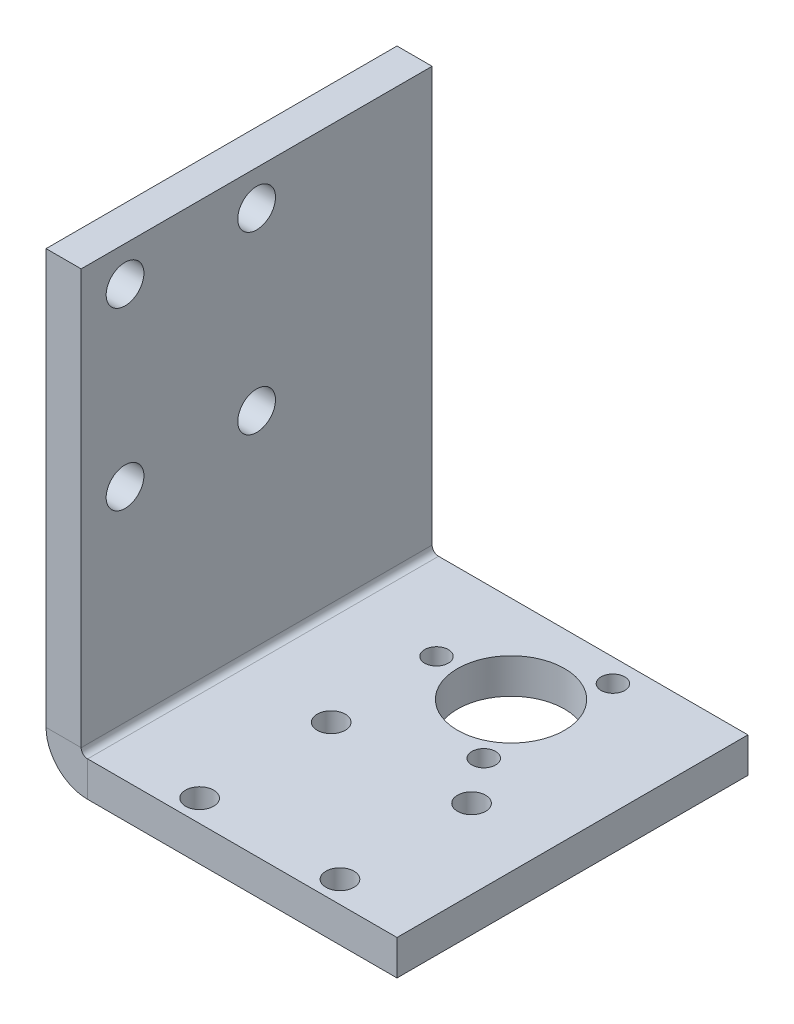
ISO-10303-21;
HEADER;
FILE_DESCRIPTION(('STEP AP214'),'2;1');
FILE_NAME('part.step','',(''),(''),'','','');
FILE_SCHEMA(('AUTOMOTIVE_DESIGN { 1 0 10303 214 1 1 1 1 }'));
ENDSEC;
DATA;
#1=APPLICATION_CONTEXT('core data for automotive mechanical design processes');
#2=APPLICATION_PROTOCOL_DEFINITION('international standard','automotive_design',2000,#1);
#3=PRODUCT_CONTEXT('',#1,'mechanical');
#4=PRODUCT('Part','Part','',(#3));
#5=PRODUCT_RELATED_PRODUCT_CATEGORY('part','',(#4));
#6=PRODUCT_DEFINITION_FORMATION('','',#4);
#7=PRODUCT_DEFINITION_CONTEXT('part definition',#1,'design');
#8=PRODUCT_DEFINITION('design','',#6,#7);
#9=PRODUCT_DEFINITION_SHAPE('','',#8);
#10=(LENGTH_UNIT() NAMED_UNIT(*) SI_UNIT(.MILLI.,.METRE.));
#11=(NAMED_UNIT(*) PLANE_ANGLE_UNIT() SI_UNIT($,.RADIAN.));
#12=(NAMED_UNIT(*) SI_UNIT($,.STERADIAN.) SOLID_ANGLE_UNIT());
#13=UNCERTAINTY_MEASURE_WITH_UNIT(LENGTH_MEASURE(1.E-05),#10,'distance_accuracy_value','');
#14=(GEOMETRIC_REPRESENTATION_CONTEXT(3) GLOBAL_UNCERTAINTY_ASSIGNED_CONTEXT((#13)) GLOBAL_UNIT_ASSIGNED_CONTEXT((#10,
#11,#12)) REPRESENTATION_CONTEXT('',''));
#15=CARTESIAN_POINT('',(0.,0.,0.));
#16=DIRECTION('',(0.,0.,1.));
#17=DIRECTION('',(1.,0.,0.));
#18=AXIS2_PLACEMENT_3D('',#15,#16,#17);
#19=CARTESIAN_POINT('',(0.7366,0.,20.));
#20=DIRECTION('',(0.,0.,1.));
#21=DIRECTION('',(1.,0.,0.));
#22=AXIS2_PLACEMENT_3D('',#19,#20,#21);
#23=PLANE('',#22);
#24=DIRECTION('',(0.,-1.,0.));
#25=VECTOR('',#24,1.);
#26=CARTESIAN_POINT('',(0.7366,0.,20.));
#27=LINE('',#26,#25);
#28=CARTESIAN_POINT('',(0.7366,0.,20.));
#29=VERTEX_POINT('',#28);
#30=CARTESIAN_POINT('',(0.7366,-4.,20.));
#31=VERTEX_POINT('',#30);
#32=EDGE_CURVE('E11',#29,#31,#27,.T.);
#33=ORIENTED_EDGE('',*,*,#32,.F.);
#34=CARTESIAN_POINT('',(0.7366,0.7366,20.));
#35=DIRECTION('',(0.,0.,-1.));
#36=DIRECTION('',(-1.,0.,0.));
#37=AXIS2_PLACEMENT_3D('',#34,#35,#36);
#38=CIRCLE('',#37,0.7366);
#39=CARTESIAN_POINT('',(0.,0.7366,20.));
#40=VERTEX_POINT('',#39);
#41=EDGE_CURVE('E138',#40,#29,#38,.F.);
#42=ORIENTED_EDGE('',*,*,#41,.F.);
#43=DIRECTION('',(1.,0.,0.));
#44=VECTOR('',#43,1.);
#45=CARTESIAN_POINT('',(-4.,0.736600000000001,20.));
#46=LINE('',#45,#44);
#47=CARTESIAN_POINT('',(-4.,0.736600000000001,20.));
#48=VERTEX_POINT('',#47);
#49=EDGE_CURVE('E48',#48,#40,#46,.T.);
#50=ORIENTED_EDGE('',*,*,#49,.F.);
#51=CARTESIAN_POINT('',(0.7366,0.7366,20.));
#52=DIRECTION('',(0.,0.,1.));
#53=DIRECTION('',(1.,0.,0.));
#54=AXIS2_PLACEMENT_3D('',#51,#52,#53);
#55=CIRCLE('',#54,4.7366);
#56=EDGE_CURVE('E131',#48,#31,#55,.T.);
#57=ORIENTED_EDGE('',*,*,#56,.T.);
#58=EDGE_LOOP('',(#33,#42,#50,#57));
#59=FACE_BOUND('',#58,.T.);
#60=ADVANCED_FACE('F39',(#59),#23,.T.);
#61=CARTESIAN_POINT('',(-4.,0.736600000000001,20.));
#62=DIRECTION('',(0.,0.,1.));
#63=DIRECTION('',(1.,0.,0.));
#64=AXIS2_PLACEMENT_3D('',#61,#62,#63);
#65=PLANE('',#64);
#66=DIRECTION('',(1.,0.,0.));
#67=VECTOR('',#66,1.);
#68=CARTESIAN_POINT('',(0.,0.,20.));
#69=LINE('',#68,#67);
#70=CARTESIAN_POINT('',(36.,0.,20.));
#71=VERTEX_POINT('',#70);
#72=EDGE_CURVE('E221',#29,#71,#69,.T.);
#73=ORIENTED_EDGE('',*,*,#72,.F.);
#74=ORIENTED_EDGE('',*,*,#32,.T.);
#75=DIRECTION('',(1.,0.,0.));
#76=VECTOR('',#75,1.);
#77=CARTESIAN_POINT('',(0.,-4.,20.));
#78=LINE('',#77,#76);
#79=CARTESIAN_POINT('',(36.,-4.,20.));
#80=VERTEX_POINT('',#79);
#81=EDGE_CURVE('E97',#31,#80,#78,.T.);
#82=ORIENTED_EDGE('',*,*,#81,.T.);
#83=DIRECTION('',(0.,-1.,0.));
#84=VECTOR('',#83,1.);
#85=CARTESIAN_POINT('',(36.,0.,20.));
#86=LINE('',#85,#84);
#87=EDGE_CURVE('E218',#71,#80,#86,.T.);
#88=ORIENTED_EDGE('',*,*,#87,.F.);
#89=EDGE_LOOP('',(#73,#74,#82,#88));
#90=FACE_BOUND('',#89,.T.);
#91=ADVANCED_FACE('F241',(#90),#65,.T.);
#92=CARTESIAN_POINT('',(0.,0.7366,-20.));
#93=DIRECTION('',(0.,0.,-1.));
#94=DIRECTION('',(-1.,0.,0.));
#95=AXIS2_PLACEMENT_3D('',#92,#93,#94);
#96=PLANE('',#95);
#97=DIRECTION('',(-1.,0.,0.));
#98=VECTOR('',#97,1.);
#99=CARTESIAN_POINT('',(0.,0.7366,-20.));
#100=LINE('',#99,#98);
#101=CARTESIAN_POINT('',(0.,0.7366,-20.));
#102=VERTEX_POINT('',#101);
#103=CARTESIAN_POINT('',(-4.,0.736600000000001,-20.));
#104=VERTEX_POINT('',#103);
#105=EDGE_CURVE('E84',#102,#104,#100,.T.);
#106=ORIENTED_EDGE('',*,*,#105,.F.);
#107=CARTESIAN_POINT('',(0.7366,0.7366,-20.));
#108=DIRECTION('',(0.,0.,-1.));
#109=DIRECTION('',(-1.,0.,0.));
#110=AXIS2_PLACEMENT_3D('',#107,#108,#109);
#111=CIRCLE('',#110,0.7366);
#112=CARTESIAN_POINT('',(0.7366,0.,-20.));
#113=VERTEX_POINT('',#112);
#114=EDGE_CURVE('E154',#102,#113,#111,.F.);
#115=ORIENTED_EDGE('',*,*,#114,.T.);
#116=DIRECTION('',(0.,1.,0.));
#117=VECTOR('',#116,1.);
#118=CARTESIAN_POINT('',(0.7366,-4.,-20.));
#119=LINE('',#118,#117);
#120=CARTESIAN_POINT('',(0.7366,-4.,-20.));
#121=VERTEX_POINT('',#120);
#122=EDGE_CURVE('E91',#121,#113,#119,.T.);
#123=ORIENTED_EDGE('',*,*,#122,.F.);
#124=CARTESIAN_POINT('',(0.7366,0.7366,-20.));
#125=DIRECTION('',(0.,0.,1.));
#126=DIRECTION('',(1.,0.,0.));
#127=AXIS2_PLACEMENT_3D('',#124,#125,#126);
#128=CIRCLE('',#127,4.7366);
#129=EDGE_CURVE('E161',#104,#121,#128,.T.);
#130=ORIENTED_EDGE('',*,*,#129,.F.);
#131=EDGE_LOOP('',(#106,#115,#123,#130));
#132=FACE_BOUND('',#131,.T.);
#133=ADVANCED_FACE('F239',(#132),#96,.T.);
#134=CARTESIAN_POINT('',(0.7366,-4.,-20.));
#135=DIRECTION('',(0.,0.,-1.));
#136=DIRECTION('',(-1.,0.,0.));
#137=AXIS2_PLACEMENT_3D('',#134,#135,#136);
#138=PLANE('',#137);
#139=DIRECTION('',(0.,-1.,0.));
#140=VECTOR('',#139,1.);
#141=CARTESIAN_POINT('',(0.,0.,-20.));
#142=LINE('',#141,#140);
#143=CARTESIAN_POINT('',(0.,48.,-20.));
#144=VERTEX_POINT('',#143);
#145=EDGE_CURVE('E156',#144,#102,#142,.T.);
#146=ORIENTED_EDGE('',*,*,#145,.T.);
#147=ORIENTED_EDGE('',*,*,#105,.T.);
#148=DIRECTION('',(0.,1.,0.));
#149=VECTOR('',#148,1.);
#150=CARTESIAN_POINT('',(-4.,0.,-20.));
#151=LINE('',#150,#149);
#152=CARTESIAN_POINT('',(-4.,48.,-20.));
#153=VERTEX_POINT('',#152);
#154=EDGE_CURVE('E159',#153,#104,#151,.F.);
#155=ORIENTED_EDGE('',*,*,#154,.F.);
#156=DIRECTION('',(1.,0.,0.));
#157=VECTOR('',#156,1.);
#158=CARTESIAN_POINT('',(-4.,48.,-20.));
#159=LINE('',#158,#157);
#160=EDGE_CURVE('E119',#153,#144,#159,.T.);
#161=ORIENTED_EDGE('',*,*,#160,.T.);
#162=EDGE_LOOP('',(#146,#147,#155,#161));
#163=FACE_BOUND('',#162,.T.);
#164=ADVANCED_FACE('F235',(#163),#138,.T.);
#165=CARTESIAN_POINT('',(0.,-4.,20.));
#166=DIRECTION('',(0.,1.,0.));
#167=DIRECTION('',(0.,0.,1.));
#168=AXIS2_PLACEMENT_3D('',#165,#166,#167);
#169=PLANE('',#168);
#170=CARTESIAN_POINT('',(23.2499999999999,-4.,-17.3612159321678));
#171=DIRECTION('',(0.,-1.,0.));
#172=DIRECTION('',(0.,0.,-1.));
#173=AXIS2_PLACEMENT_3D('',#170,#171,#172);
#174=CIRCLE('',#173,1.34999999999999);
#175=CARTESIAN_POINT('',(23.2499999999999,-4.,-18.7112159321678));
#176=VERTEX_POINT('',#175);
#177=EDGE_CURVE('E497',#176,#176,#174,.T.);
#178=ORIENTED_EDGE('',*,*,#177,.F.);
#179=EDGE_LOOP('',(#178));
#180=FACE_BOUND('',#179,.T.);
#181=CARTESIAN_POINT('',(23.25,-4.,-2.63878406783229));
#182=DIRECTION('',(0.,-1.,0.));
#183=DIRECTION('',(0.,0.,-1.));
#184=AXIS2_PLACEMENT_3D('',#181,#182,#183);
#185=CIRCLE('',#184,1.34999999999999);
#186=CARTESIAN_POINT('',(23.25,-4.,-3.98878406783228));
#187=VERTEX_POINT('',#186);
#188=EDGE_CURVE('E499',#187,#187,#185,.T.);
#189=ORIENTED_EDGE('',*,*,#188,.F.);
#190=EDGE_LOOP('',(#189));
#191=FACE_BOUND('',#190,.T.);
#192=CARTESIAN_POINT('',(10.5,-4.,-10.));
#193=DIRECTION('',(0.,-1.,0.));
#194=DIRECTION('',(0.,0.,-1.));
#195=AXIS2_PLACEMENT_3D('',#192,#193,#194);
#196=CIRCLE('',#195,1.35);
#197=CARTESIAN_POINT('',(10.5,-4.,-11.35));
#198=VERTEX_POINT('',#197);
#199=EDGE_CURVE('E506',#198,#198,#196,.T.);
#200=ORIENTED_EDGE('',*,*,#199,.F.);
#201=EDGE_LOOP('',(#200));
#202=FACE_BOUND('',#201,.T.);
#203=CARTESIAN_POINT('',(19.,-4.,-10.));
#204=DIRECTION('',(0.,-1.,0.));
#205=DIRECTION('',(0.,0.,-1.));
#206=AXIS2_PLACEMENT_3D('',#203,#204,#205);
#207=CIRCLE('',#206,6.1);
#208=CARTESIAN_POINT('',(19.,-4.,-16.1));
#209=VERTEX_POINT('',#208);
#210=EDGE_CURVE('E182',#209,#209,#207,.T.);
#211=ORIENTED_EDGE('',*,*,#210,.F.);
#212=EDGE_LOOP('',(#211));
#213=FACE_BOUND('',#212,.T.);
#214=CARTESIAN_POINT('',(27.,-4.,17.5));
#215=DIRECTION('',(0.,1.,0.));
#216=DIRECTION('',(0.,0.,1.));
#217=AXIS2_PLACEMENT_3D('',#214,#215,#216);
#218=CIRCLE('',#217,1.59999999999999);
#219=CARTESIAN_POINT('',(27.,-4.,19.1));
#220=VERTEX_POINT('',#219);
#221=EDGE_CURVE('E186',#220,#220,#218,.T.);
#222=ORIENTED_EDGE('',*,*,#221,.T.);
#223=EDGE_LOOP('',(#222));
#224=FACE_BOUND('',#223,.T.);
#225=CARTESIAN_POINT('',(11.,-4.,2.5));
#226=DIRECTION('',(0.,1.,0.));
#227=DIRECTION('',(0.,0.,1.));
#228=AXIS2_PLACEMENT_3D('',#225,#226,#227);
#229=CIRCLE('',#228,1.59999999999999);
#230=CARTESIAN_POINT('',(11.,-4.,4.09999999999999));
#231=VERTEX_POINT('',#230);
#232=EDGE_CURVE('E203',#231,#231,#229,.T.);
#233=ORIENTED_EDGE('',*,*,#232,.T.);
#234=EDGE_LOOP('',(#233));
#235=FACE_BOUND('',#234,.T.);
#236=CARTESIAN_POINT('',(11.,-4.,17.5));
#237=DIRECTION('',(0.,1.,0.));
#238=DIRECTION('',(0.,0.,1.));
#239=AXIS2_PLACEMENT_3D('',#236,#237,#238);
#240=CIRCLE('',#239,1.59999999999999);
#241=CARTESIAN_POINT('',(11.,-4.,19.1));
#242=VERTEX_POINT('',#241);
#243=EDGE_CURVE('E209',#242,#242,#240,.T.);
#244=ORIENTED_EDGE('',*,*,#243,.T.);
#245=EDGE_LOOP('',(#244));
#246=FACE_BOUND('',#245,.T.);
#247=CARTESIAN_POINT('',(27.,-4.,2.5));
#248=DIRECTION('',(0.,1.,0.));
#249=DIRECTION('',(0.,0.,1.));
#250=AXIS2_PLACEMENT_3D('',#247,#248,#249);
#251=CIRCLE('',#250,1.59999999999999);
#252=CARTESIAN_POINT('',(27.,-4.,4.09999999999999));
#253=VERTEX_POINT('',#252);
#254=EDGE_CURVE('E148',#253,#253,#251,.T.);
#255=ORIENTED_EDGE('',*,*,#254,.T.);
#256=EDGE_LOOP('',(#255));
#257=FACE_BOUND('',#256,.T.);
#258=DIRECTION('',(1.,0.,0.));
#259=VECTOR('',#258,1.);
#260=CARTESIAN_POINT('',(0.,-4.,-20.));
#261=LINE('',#260,#259);
#262=CARTESIAN_POINT('',(36.,-4.,-20.));
#263=VERTEX_POINT('',#262);
#264=EDGE_CURVE('E144',#121,#263,#261,.T.);
#265=ORIENTED_EDGE('',*,*,#264,.T.);
#266=DIRECTION('',(0.,0.,-1.));
#267=VECTOR('',#266,1.);
#268=CARTESIAN_POINT('',(36.,-4.,20.));
#269=LINE('',#268,#267);
#270=EDGE_CURVE('E175',#80,#263,#269,.T.);
#271=ORIENTED_EDGE('',*,*,#270,.F.);
#272=ORIENTED_EDGE('',*,*,#81,.F.);
#273=DIRECTION('',(0.,0.,-1.));
#274=VECTOR('',#273,1.);
#275=CARTESIAN_POINT('',(0.7366,-4.,20.));
#276=LINE('',#275,#274);
#277=EDGE_CURVE('E143',#31,#121,#276,.T.);
#278=ORIENTED_EDGE('',*,*,#277,.T.);
#279=EDGE_LOOP('',(#265,#271,#272,#278));
#280=FACE_BOUND('',#279,.T.);
#281=ADVANCED_FACE('F247',(#180,#191,#202,#213,#224,#235,#246,#257,#280),#169,.F.);
#282=CARTESIAN_POINT('',(36.,0.,20.));
#283=DIRECTION('',(1.,0.,0.));
#284=DIRECTION('',(0.,0.,-1.));
#285=AXIS2_PLACEMENT_3D('',#282,#283,#284);
#286=PLANE('',#285);
#287=DIRECTION('',(0.,-1.,0.));
#288=VECTOR('',#287,1.);
#289=CARTESIAN_POINT('',(36.,0.,-20.));
#290=LINE('',#289,#288);
#291=CARTESIAN_POINT('',(36.,0.,-20.));
#292=VERTEX_POINT('',#291);
#293=EDGE_CURVE('E147',#292,#263,#290,.T.);
#294=ORIENTED_EDGE('',*,*,#293,.F.);
#295=DIRECTION('',(0.,0.,-1.));
#296=VECTOR('',#295,1.);
#297=CARTESIAN_POINT('',(36.,0.,20.));
#298=LINE('',#297,#296);
#299=EDGE_CURVE('E173',#71,#292,#298,.T.);
#300=ORIENTED_EDGE('',*,*,#299,.F.);
#301=ORIENTED_EDGE('',*,*,#87,.T.);
#302=ORIENTED_EDGE('',*,*,#270,.T.);
#303=EDGE_LOOP('',(#294,#300,#301,#302));
#304=FACE_BOUND('',#303,.T.);
#305=ADVANCED_FACE('F276',(#304),#286,.T.);
#306=CARTESIAN_POINT('',(0.,0.,20.));
#307=DIRECTION('',(0.,1.,0.));
#308=DIRECTION('',(0.,0.,1.));
#309=AXIS2_PLACEMENT_3D('',#306,#307,#308);
#310=PLANE('',#309);
#311=CARTESIAN_POINT('',(23.2499999999999,0.,-17.3612159321678));
#312=DIRECTION('',(0.,1.,0.));
#313=DIRECTION('',(0.,0.,1.));
#314=AXIS2_PLACEMENT_3D('',#311,#312,#313);
#315=CIRCLE('',#314,1.34999999999999);
#316=CARTESIAN_POINT('',(23.2499999999999,0.,-16.0112159321678));
#317=VERTEX_POINT('',#316);
#318=EDGE_CURVE('E42',#317,#317,#315,.T.);
#319=ORIENTED_EDGE('',*,*,#318,.F.);
#320=EDGE_LOOP('',(#319));
#321=FACE_BOUND('',#320,.T.);
#322=CARTESIAN_POINT('',(23.25,0.,-2.63878406783229));
#323=DIRECTION('',(0.,1.,0.));
#324=DIRECTION('',(0.,0.,1.));
#325=AXIS2_PLACEMENT_3D('',#322,#323,#324);
#326=CIRCLE('',#325,1.34999999999999);
#327=CARTESIAN_POINT('',(23.25,0.,-1.2887840678323));
#328=VERTEX_POINT('',#327);
#329=EDGE_CURVE('E503',#328,#328,#326,.T.);
#330=ORIENTED_EDGE('',*,*,#329,.F.);
#331=EDGE_LOOP('',(#330));
#332=FACE_BOUND('',#331,.T.);
#333=CARTESIAN_POINT('',(10.5,0.,-10.));
#334=DIRECTION('',(0.,1.,0.));
#335=DIRECTION('',(0.,0.,1.));
#336=AXIS2_PLACEMENT_3D('',#333,#334,#335);
#337=CIRCLE('',#336,1.34999999999999);
#338=CARTESIAN_POINT('',(10.5,0.,-8.65000000000001));
#339=VERTEX_POINT('',#338);
#340=EDGE_CURVE('E509',#339,#339,#337,.T.);
#341=ORIENTED_EDGE('',*,*,#340,.F.);
#342=EDGE_LOOP('',(#341));
#343=FACE_BOUND('',#342,.T.);
#344=CARTESIAN_POINT('',(19.,0.,-10.));
#345=DIRECTION('',(0.,1.,0.));
#346=DIRECTION('',(0.,0.,1.));
#347=AXIS2_PLACEMENT_3D('',#344,#345,#346);
#348=CIRCLE('',#347,6.1);
#349=CARTESIAN_POINT('',(19.,0.,-3.9));
#350=VERTEX_POINT('',#349);
#351=EDGE_CURVE('E179',#350,#350,#348,.T.);
#352=ORIENTED_EDGE('',*,*,#351,.F.);
#353=EDGE_LOOP('',(#352));
#354=FACE_BOUND('',#353,.T.);
#355=CARTESIAN_POINT('',(27.,0.,17.5));
#356=DIRECTION('',(0.,1.,0.));
#357=DIRECTION('',(0.,0.,1.));
#358=AXIS2_PLACEMENT_3D('',#355,#356,#357);
#359=CIRCLE('',#358,1.59999999999999);
#360=CARTESIAN_POINT('',(27.,0.,19.1));
#361=VERTEX_POINT('',#360);
#362=EDGE_CURVE('E181',#361,#361,#359,.T.);
#363=ORIENTED_EDGE('',*,*,#362,.F.);
#364=EDGE_LOOP('',(#363));
#365=FACE_BOUND('',#364,.T.);
#366=CARTESIAN_POINT('',(11.,0.,2.5));
#367=DIRECTION('',(0.,1.,0.));
#368=DIRECTION('',(0.,0.,1.));
#369=AXIS2_PLACEMENT_3D('',#366,#367,#368);
#370=CIRCLE('',#369,1.59999999999999);
#371=CARTESIAN_POINT('',(11.,0.,4.09999999999998));
#372=VERTEX_POINT('',#371);
#373=EDGE_CURVE('E200',#372,#372,#370,.T.);
#374=ORIENTED_EDGE('',*,*,#373,.F.);
#375=EDGE_LOOP('',(#374));
#376=FACE_BOUND('',#375,.T.);
#377=CARTESIAN_POINT('',(11.,0.,17.5));
#378=DIRECTION('',(0.,1.,0.));
#379=DIRECTION('',(0.,0.,1.));
#380=AXIS2_PLACEMENT_3D('',#377,#378,#379);
#381=CIRCLE('',#380,1.59999999999999);
#382=CARTESIAN_POINT('',(11.,0.,19.1));
#383=VERTEX_POINT('',#382);
#384=EDGE_CURVE('E206',#383,#383,#381,.T.);
#385=ORIENTED_EDGE('',*,*,#384,.F.);
#386=EDGE_LOOP('',(#385));
#387=FACE_BOUND('',#386,.T.);
#388=CARTESIAN_POINT('',(27.,0.,2.5));
#389=DIRECTION('',(0.,1.,0.));
#390=DIRECTION('',(0.,0.,1.));
#391=AXIS2_PLACEMENT_3D('',#388,#389,#390);
#392=CIRCLE('',#391,1.59999999999999);
#393=CARTESIAN_POINT('',(27.,0.,4.09999999999999));
#394=VERTEX_POINT('',#393);
#395=EDGE_CURVE('E212',#394,#394,#392,.T.);
#396=ORIENTED_EDGE('',*,*,#395,.F.);
#397=EDGE_LOOP('',(#396));
#398=FACE_BOUND('',#397,.T.);
#399=DIRECTION('',(1.,0.,0.));
#400=VECTOR('',#399,1.);
#401=CARTESIAN_POINT('',(0.,0.,-20.));
#402=LINE('',#401,#400);
#403=EDGE_CURVE('E151',#113,#292,#402,.T.);
#404=ORIENTED_EDGE('',*,*,#403,.F.);
#405=DIRECTION('',(0.,0.,-1.));
#406=VECTOR('',#405,1.);
#407=CARTESIAN_POINT('',(0.7366,0.,20.));
#408=LINE('',#407,#406);
#409=EDGE_CURVE('E170',#29,#113,#408,.T.);
#410=ORIENTED_EDGE('',*,*,#409,.F.);
#411=ORIENTED_EDGE('',*,*,#72,.T.);
#412=ORIENTED_EDGE('',*,*,#299,.T.);
#413=EDGE_LOOP('',(#404,#410,#411,#412));
#414=FACE_BOUND('',#413,.T.);
#415=ADVANCED_FACE('F281',(#321,#332,#343,#354,#365,#376,#387,#398,#414),#310,.T.);
#416=CARTESIAN_POINT('',(0.7366,0.7366,20.));
#417=DIRECTION('',(0.,0.,-1.));
#418=DIRECTION('',(-1.,0.,0.));
#419=AXIS2_PLACEMENT_3D('',#416,#417,#418);
#420=CYLINDRICAL_SURFACE('',#419,0.7366);
#421=ORIENTED_EDGE('',*,*,#114,.F.);
#422=DIRECTION('',(0.,0.,-1.));
#423=VECTOR('',#422,1.);
#424=CARTESIAN_POINT('',(0.,0.7366,20.));
#425=LINE('',#424,#423);
#426=EDGE_CURVE('E167',#40,#102,#425,.T.);
#427=ORIENTED_EDGE('',*,*,#426,.F.);
#428=ORIENTED_EDGE('',*,*,#41,.T.);
#429=ORIENTED_EDGE('',*,*,#409,.T.);
#430=EDGE_LOOP('',(#421,#427,#428,#429));
#431=FACE_BOUND('',#430,.T.);
#432=ADVANCED_FACE('F228',(#431),#420,.F.);
#433=CARTESIAN_POINT('',(0.,0.,20.));
#434=DIRECTION('',(1.,0.,0.));
#435=DIRECTION('',(0.,0.,-1.));
#436=AXIS2_PLACEMENT_3D('',#433,#434,#435);
#437=PLANE('',#436);
#438=CARTESIAN_POINT('',(0.,44.,15.));
#439=DIRECTION('',(1.,0.,0.));
#440=DIRECTION('',(0.,0.,-1.));
#441=AXIS2_PLACEMENT_3D('',#438,#439,#440);
#442=CIRCLE('',#441,2.14999999999999);
#443=CARTESIAN_POINT('',(0.,44.,12.85));
#444=VERTEX_POINT('',#443);
#445=EDGE_CURVE('E512',#444,#444,#442,.T.);
#446=ORIENTED_EDGE('',*,*,#445,.F.);
#447=EDGE_LOOP('',(#446));
#448=FACE_BOUND('',#447,.T.);
#449=CARTESIAN_POINT('',(0.,24.,15.));
#450=DIRECTION('',(1.,0.,0.));
#451=DIRECTION('',(0.,0.,-1.));
#452=AXIS2_PLACEMENT_3D('',#449,#450,#451);
#453=CIRCLE('',#452,2.15);
#454=CARTESIAN_POINT('',(0.,24.,12.85));
#455=VERTEX_POINT('',#454);
#456=EDGE_CURVE('E518',#455,#455,#453,.T.);
#457=ORIENTED_EDGE('',*,*,#456,.F.);
#458=EDGE_LOOP('',(#457));
#459=FACE_BOUND('',#458,.T.);
#460=CARTESIAN_POINT('',(0.,24.,0.));
#461=DIRECTION('',(1.,0.,0.));
#462=DIRECTION('',(0.,0.,-1.));
#463=AXIS2_PLACEMENT_3D('',#460,#461,#462);
#464=CIRCLE('',#463,2.15);
#465=CARTESIAN_POINT('',(0.,24.,-2.14999999999999));
#466=VERTEX_POINT('',#465);
#467=EDGE_CURVE('E524',#466,#466,#464,.T.);
#468=ORIENTED_EDGE('',*,*,#467,.F.);
#469=EDGE_LOOP('',(#468));
#470=FACE_BOUND('',#469,.T.);
#471=CARTESIAN_POINT('',(0.,44.,0.));
#472=DIRECTION('',(1.,0.,0.));
#473=DIRECTION('',(0.,0.,-1.));
#474=AXIS2_PLACEMENT_3D('',#471,#472,#473);
#475=CIRCLE('',#474,2.14999999999999);
#476=CARTESIAN_POINT('',(0.,44.,-2.14999999999999));
#477=VERTEX_POINT('',#476);
#478=EDGE_CURVE('E194',#477,#477,#475,.T.);
#479=ORIENTED_EDGE('',*,*,#478,.F.);
#480=EDGE_LOOP('',(#479));
#481=FACE_BOUND('',#480,.T.);
#482=ORIENTED_EDGE('',*,*,#145,.F.);
#483=DIRECTION('',(0.,0.,-1.));
#484=VECTOR('',#483,1.);
#485=CARTESIAN_POINT('',(0.,48.,20.));
#486=LINE('',#485,#484);
#487=CARTESIAN_POINT('',(0.,48.,20.));
#488=VERTEX_POINT('',#487);
#489=EDGE_CURVE('E121',#488,#144,#486,.T.);
#490=ORIENTED_EDGE('',*,*,#489,.F.);
#491=DIRECTION('',(0.,-1.,0.));
#492=VECTOR('',#491,1.);
#493=CARTESIAN_POINT('',(0.,0.,20.));
#494=LINE('',#493,#492);
#495=EDGE_CURVE('E136',#488,#40,#494,.T.);
#496=ORIENTED_EDGE('',*,*,#495,.T.);
#497=ORIENTED_EDGE('',*,*,#426,.T.);
#498=EDGE_LOOP('',(#482,#490,#496,#497));
#499=FACE_BOUND('',#498,.T.);
#500=ADVANCED_FACE('F234',(#448,#459,#470,#481,#499),#437,.T.);
#501=CARTESIAN_POINT('',(-4.,48.,20.));
#502=DIRECTION('',(0.,1.,0.));
#503=DIRECTION('',(0.,0.,1.));
#504=AXIS2_PLACEMENT_3D('',#501,#502,#503);
#505=PLANE('',#504);
#506=ORIENTED_EDGE('',*,*,#160,.F.);
#507=DIRECTION('',(0.,0.,-1.));
#508=VECTOR('',#507,1.);
#509=CARTESIAN_POINT('',(-4.,48.,20.));
#510=LINE('',#509,#508);
#511=CARTESIAN_POINT('',(-4.,48.,20.));
#512=VERTEX_POINT('',#511);
#513=EDGE_CURVE('E113',#512,#153,#510,.T.);
#514=ORIENTED_EDGE('',*,*,#513,.F.);
#515=DIRECTION('',(1.,0.,0.));
#516=VECTOR('',#515,1.);
#517=CARTESIAN_POINT('',(-4.,48.,20.));
#518=LINE('',#517,#516);
#519=EDGE_CURVE('E117',#512,#488,#518,.T.);
#520=ORIENTED_EDGE('',*,*,#519,.T.);
#521=ORIENTED_EDGE('',*,*,#489,.T.);
#522=EDGE_LOOP('',(#506,#514,#520,#521));
#523=FACE_BOUND('',#522,.T.);
#524=ADVANCED_FACE('F115',(#523),#505,.T.);
#525=CARTESIAN_POINT('',(-4.,0.,20.));
#526=DIRECTION('',(1.,0.,0.));
#527=DIRECTION('',(0.,0.,-1.));
#528=AXIS2_PLACEMENT_3D('',#525,#526,#527);
#529=PLANE('',#528);
#530=CARTESIAN_POINT('',(-4.,44.,15.));
#531=DIRECTION('',(1.,0.,0.));
#532=DIRECTION('',(0.,0.,-1.));
#533=AXIS2_PLACEMENT_3D('',#530,#531,#532);
#534=CIRCLE('',#533,2.14999999999999);
#535=CARTESIAN_POINT('',(-4.,44.,12.85));
#536=VERTEX_POINT('',#535);
#537=EDGE_CURVE('E515',#536,#536,#534,.T.);
#538=ORIENTED_EDGE('',*,*,#537,.T.);
#539=EDGE_LOOP('',(#538));
#540=FACE_BOUND('',#539,.T.);
#541=CARTESIAN_POINT('',(-4.,24.,15.));
#542=DIRECTION('',(1.,0.,0.));
#543=DIRECTION('',(0.,0.,-1.));
#544=AXIS2_PLACEMENT_3D('',#541,#542,#543);
#545=CIRCLE('',#544,2.15);
#546=CARTESIAN_POINT('',(-4.,24.,12.85));
#547=VERTEX_POINT('',#546);
#548=EDGE_CURVE('E521',#547,#547,#545,.T.);
#549=ORIENTED_EDGE('',*,*,#548,.T.);
#550=EDGE_LOOP('',(#549));
#551=FACE_BOUND('',#550,.T.);
#552=CARTESIAN_POINT('',(-4.,24.,0.));
#553=DIRECTION('',(1.,0.,0.));
#554=DIRECTION('',(0.,0.,-1.));
#555=AXIS2_PLACEMENT_3D('',#552,#553,#554);
#556=CIRCLE('',#555,2.15);
#557=CARTESIAN_POINT('',(-4.,24.,-2.14999999999999));
#558=VERTEX_POINT('',#557);
#559=EDGE_CURVE('E527',#558,#558,#556,.T.);
#560=ORIENTED_EDGE('',*,*,#559,.T.);
#561=EDGE_LOOP('',(#560));
#562=FACE_BOUND('',#561,.T.);
#563=CARTESIAN_POINT('',(-4.,44.,0.));
#564=DIRECTION('',(1.,0.,0.));
#565=DIRECTION('',(0.,0.,-1.));
#566=AXIS2_PLACEMENT_3D('',#563,#564,#565);
#567=CIRCLE('',#566,2.14999999999999);
#568=CARTESIAN_POINT('',(-4.,44.,-2.14999999999999));
#569=VERTEX_POINT('',#568);
#570=EDGE_CURVE('E189',#569,#569,#567,.T.);
#571=ORIENTED_EDGE('',*,*,#570,.T.);
#572=EDGE_LOOP('',(#571));
#573=FACE_BOUND('',#572,.T.);
#574=ORIENTED_EDGE('',*,*,#154,.T.);
#575=DIRECTION('',(0.,0.,-1.));
#576=VECTOR('',#575,1.);
#577=CARTESIAN_POINT('',(-4.,0.736600000000001,20.));
#578=LINE('',#577,#576);
#579=EDGE_CURVE('E122',#48,#104,#578,.T.);
#580=ORIENTED_EDGE('',*,*,#579,.F.);
#581=DIRECTION('',(0.,1.,0.));
#582=VECTOR('',#581,1.);
#583=CARTESIAN_POINT('',(-4.,0.,20.));
#584=LINE('',#583,#582);
#585=EDGE_CURVE('E126',#512,#48,#584,.F.);
#586=ORIENTED_EDGE('',*,*,#585,.F.);
#587=ORIENTED_EDGE('',*,*,#513,.T.);
#588=EDGE_LOOP('',(#574,#580,#586,#587));
#589=FACE_BOUND('',#588,.T.);
#590=ADVANCED_FACE('F127',(#540,#551,#562,#573,#589),#529,.F.);
#591=CARTESIAN_POINT('',(0.7366,0.7366,20.));
#592=DIRECTION('',(0.,0.,-1.));
#593=DIRECTION('',(-1.,0.,0.));
#594=AXIS2_PLACEMENT_3D('',#591,#592,#593);
#595=CYLINDRICAL_SURFACE('',#594,4.7366);
#596=ORIENTED_EDGE('',*,*,#129,.T.);
#597=ORIENTED_EDGE('',*,*,#277,.F.);
#598=ORIENTED_EDGE('',*,*,#56,.F.);
#599=ORIENTED_EDGE('',*,*,#579,.T.);
#600=EDGE_LOOP('',(#596,#597,#598,#599));
#601=FACE_BOUND('',#600,.T.);
#602=ADVANCED_FACE('F237',(#601),#595,.T.);
#603=CARTESIAN_POINT('',(0.7366,0.7366,20.));
#604=DIRECTION('',(0.,0.,-1.));
#605=DIRECTION('',(-1.,0.,0.));
#606=AXIS2_PLACEMENT_3D('',#603,#604,#605);
#607=PLANE('',#606);
#608=ORIENTED_EDGE('',*,*,#585,.T.);
#609=ORIENTED_EDGE('',*,*,#49,.T.);
#610=ORIENTED_EDGE('',*,*,#495,.F.);
#611=ORIENTED_EDGE('',*,*,#519,.F.);
#612=EDGE_LOOP('',(#608,#609,#610,#611));
#613=FACE_BOUND('',#612,.T.);
#614=ADVANCED_FACE('F134',(#613),#607,.F.);
#615=CARTESIAN_POINT('',(0.7366,0.7366,-20.));
#616=DIRECTION('',(0.,0.,-1.));
#617=DIRECTION('',(-1.,0.,0.));
#618=AXIS2_PLACEMENT_3D('',#615,#616,#617);
#619=PLANE('',#618);
#620=ORIENTED_EDGE('',*,*,#264,.F.);
#621=ORIENTED_EDGE('',*,*,#122,.T.);
#622=ORIENTED_EDGE('',*,*,#403,.T.);
#623=ORIENTED_EDGE('',*,*,#293,.T.);
#624=EDGE_LOOP('',(#620,#621,#622,#623));
#625=FACE_BOUND('',#624,.T.);
#626=ADVANCED_FACE('F325',(#625),#619,.T.);
#627=CARTESIAN_POINT('',(27.,0.,2.5));
#628=DIRECTION('',(0.,1.,0.));
#629=DIRECTION('',(0.,0.,1.));
#630=AXIS2_PLACEMENT_3D('',#627,#628,#629);
#631=CYLINDRICAL_SURFACE('',#630,1.59999999999999);
#632=ORIENTED_EDGE('',*,*,#254,.F.);
#633=EDGE_LOOP('',(#632));
#634=FACE_BOUND('',#633,.T.);
#635=ORIENTED_EDGE('',*,*,#395,.T.);
#636=EDGE_LOOP('',(#635));
#637=FACE_BOUND('',#636,.T.);
#638=ADVANCED_FACE('F335',(#634,#637),#631,.F.);
#639=CARTESIAN_POINT('',(11.,0.,17.5));
#640=DIRECTION('',(0.,1.,0.));
#641=DIRECTION('',(0.,0.,1.));
#642=AXIS2_PLACEMENT_3D('',#639,#640,#641);
#643=CYLINDRICAL_SURFACE('',#642,1.59999999999999);
#644=ORIENTED_EDGE('',*,*,#243,.F.);
#645=EDGE_LOOP('',(#644));
#646=FACE_BOUND('',#645,.T.);
#647=ORIENTED_EDGE('',*,*,#384,.T.);
#648=EDGE_LOOP('',(#647));
#649=FACE_BOUND('',#648,.T.);
#650=ADVANCED_FACE('F346',(#646,#649),#643,.F.);
#651=CARTESIAN_POINT('',(11.,0.,2.5));
#652=DIRECTION('',(0.,1.,0.));
#653=DIRECTION('',(0.,0.,1.));
#654=AXIS2_PLACEMENT_3D('',#651,#652,#653);
#655=CYLINDRICAL_SURFACE('',#654,1.59999999999999);
#656=ORIENTED_EDGE('',*,*,#232,.F.);
#657=EDGE_LOOP('',(#656));
#658=FACE_BOUND('',#657,.T.);
#659=ORIENTED_EDGE('',*,*,#373,.T.);
#660=EDGE_LOOP('',(#659));
#661=FACE_BOUND('',#660,.T.);
#662=ADVANCED_FACE('F356',(#658,#661),#655,.F.);
#663=CARTESIAN_POINT('',(27.,0.,17.5));
#664=DIRECTION('',(0.,1.,0.));
#665=DIRECTION('',(0.,0.,1.));
#666=AXIS2_PLACEMENT_3D('',#663,#664,#665);
#667=CYLINDRICAL_SURFACE('',#666,1.59999999999999);
#668=ORIENTED_EDGE('',*,*,#221,.F.);
#669=EDGE_LOOP('',(#668));
#670=FACE_BOUND('',#669,.T.);
#671=ORIENTED_EDGE('',*,*,#362,.T.);
#672=EDGE_LOOP('',(#671));
#673=FACE_BOUND('',#672,.T.);
#674=ADVANCED_FACE('F366',(#670,#673),#667,.F.);
#675=CARTESIAN_POINT('',(19.,48.,-10.));
#676=DIRECTION('',(0.,-1.,0.));
#677=DIRECTION('',(0.,0.,-1.));
#678=AXIS2_PLACEMENT_3D('',#675,#676,#677);
#679=CYLINDRICAL_SURFACE('',#678,6.1);
#680=ORIENTED_EDGE('',*,*,#351,.T.);
#681=EDGE_LOOP('',(#680));
#682=FACE_BOUND('',#681,.T.);
#683=ORIENTED_EDGE('',*,*,#210,.T.);
#684=EDGE_LOOP('',(#683));
#685=FACE_BOUND('',#684,.T.);
#686=ADVANCED_FACE('F376',(#682,#685),#679,.F.);
#687=CARTESIAN_POINT('',(0.,44.,0.));
#688=DIRECTION('',(1.,0.,0.));
#689=DIRECTION('',(0.,0.,-1.));
#690=AXIS2_PLACEMENT_3D('',#687,#688,#689);
#691=CYLINDRICAL_SURFACE('',#690,2.14999999999999);
#692=ORIENTED_EDGE('',*,*,#570,.F.);
#693=EDGE_LOOP('',(#692));
#694=FACE_BOUND('',#693,.T.);
#695=ORIENTED_EDGE('',*,*,#478,.T.);
#696=EDGE_LOOP('',(#695));
#697=FACE_BOUND('',#696,.T.);
#698=ADVANCED_FACE('F386',(#694,#697),#691,.F.);
#699=CARTESIAN_POINT('',(0.,24.,0.));
#700=DIRECTION('',(1.,0.,0.));
#701=DIRECTION('',(0.,0.,-1.));
#702=AXIS2_PLACEMENT_3D('',#699,#700,#701);
#703=CYLINDRICAL_SURFACE('',#702,2.15);
#704=ORIENTED_EDGE('',*,*,#559,.F.);
#705=EDGE_LOOP('',(#704));
#706=FACE_BOUND('',#705,.T.);
#707=ORIENTED_EDGE('',*,*,#467,.T.);
#708=EDGE_LOOP('',(#707));
#709=FACE_BOUND('',#708,.T.);
#710=ADVANCED_FACE('F412',(#706,#709),#703,.F.);
#711=CARTESIAN_POINT('',(0.,24.,15.));
#712=DIRECTION('',(1.,0.,0.));
#713=DIRECTION('',(0.,0.,-1.));
#714=AXIS2_PLACEMENT_3D('',#711,#712,#713);
#715=CYLINDRICAL_SURFACE('',#714,2.15);
#716=ORIENTED_EDGE('',*,*,#548,.F.);
#717=EDGE_LOOP('',(#716));
#718=FACE_BOUND('',#717,.T.);
#719=ORIENTED_EDGE('',*,*,#456,.T.);
#720=EDGE_LOOP('',(#719));
#721=FACE_BOUND('',#720,.T.);
#722=ADVANCED_FACE('F422',(#718,#721),#715,.F.);
#723=CARTESIAN_POINT('',(0.,44.,15.));
#724=DIRECTION('',(1.,0.,0.));
#725=DIRECTION('',(0.,0.,-1.));
#726=AXIS2_PLACEMENT_3D('',#723,#724,#725);
#727=CYLINDRICAL_SURFACE('',#726,2.14999999999999);
#728=ORIENTED_EDGE('',*,*,#537,.F.);
#729=EDGE_LOOP('',(#728));
#730=FACE_BOUND('',#729,.T.);
#731=ORIENTED_EDGE('',*,*,#445,.T.);
#732=EDGE_LOOP('',(#731));
#733=FACE_BOUND('',#732,.T.);
#734=ADVANCED_FACE('F432',(#730,#733),#727,.F.);
#735=CARTESIAN_POINT('',(10.5,-4.,-10.));
#736=DIRECTION('',(0.,-1.,0.));
#737=DIRECTION('',(0.,0.,-1.));
#738=AXIS2_PLACEMENT_3D('',#735,#736,#737);
#739=CYLINDRICAL_SURFACE('',#738,1.34999999999999);
#740=ORIENTED_EDGE('',*,*,#340,.T.);
#741=EDGE_LOOP('',(#740));
#742=FACE_BOUND('',#741,.T.);
#743=ORIENTED_EDGE('',*,*,#199,.T.);
#744=EDGE_LOOP('',(#743));
#745=FACE_BOUND('',#744,.T.);
#746=ADVANCED_FACE('F442',(#742,#745),#739,.F.);
#747=CARTESIAN_POINT('',(23.25,-4.,-2.63878406783229));
#748=DIRECTION('',(0.,-1.,0.));
#749=DIRECTION('',(0.,0.,-1.));
#750=AXIS2_PLACEMENT_3D('',#747,#748,#749);
#751=CYLINDRICAL_SURFACE('',#750,1.34999999999999);
#752=ORIENTED_EDGE('',*,*,#329,.T.);
#753=EDGE_LOOP('',(#752));
#754=FACE_BOUND('',#753,.T.);
#755=ORIENTED_EDGE('',*,*,#188,.T.);
#756=EDGE_LOOP('',(#755));
#757=FACE_BOUND('',#756,.T.);
#758=ADVANCED_FACE('F452',(#754,#757),#751,.F.);
#759=CARTESIAN_POINT('',(23.2499999999999,-4.,-17.3612159321678));
#760=DIRECTION('',(0.,-1.,0.));
#761=DIRECTION('',(0.,0.,-1.));
#762=AXIS2_PLACEMENT_3D('',#759,#760,#761);
#763=CYLINDRICAL_SURFACE('',#762,1.34999999999999);
#764=ORIENTED_EDGE('',*,*,#318,.T.);
#765=EDGE_LOOP('',(#764));
#766=FACE_BOUND('',#765,.T.);
#767=ORIENTED_EDGE('',*,*,#177,.T.);
#768=EDGE_LOOP('',(#767));
#769=FACE_BOUND('',#768,.T.);
#770=ADVANCED_FACE('F478',(#766,#769),#763,.F.);
#771=CLOSED_SHELL('',(#60,#91,#133,#164,#281,#305,#415,#432,#500,#524,#590,#602,#614,#626,#638,
#650,#662,#674,#686,#698,#710,#722,#734,#746,#758,#770));
#772=MANIFOLD_SOLID_BREP('B2',#771);
#773=ADVANCED_BREP_SHAPE_REPRESENTATION('',(#18,#772),#14);
#774=SHAPE_DEFINITION_REPRESENTATION(#9,#773);
ENDSEC;
END-ISO-10303-21;
